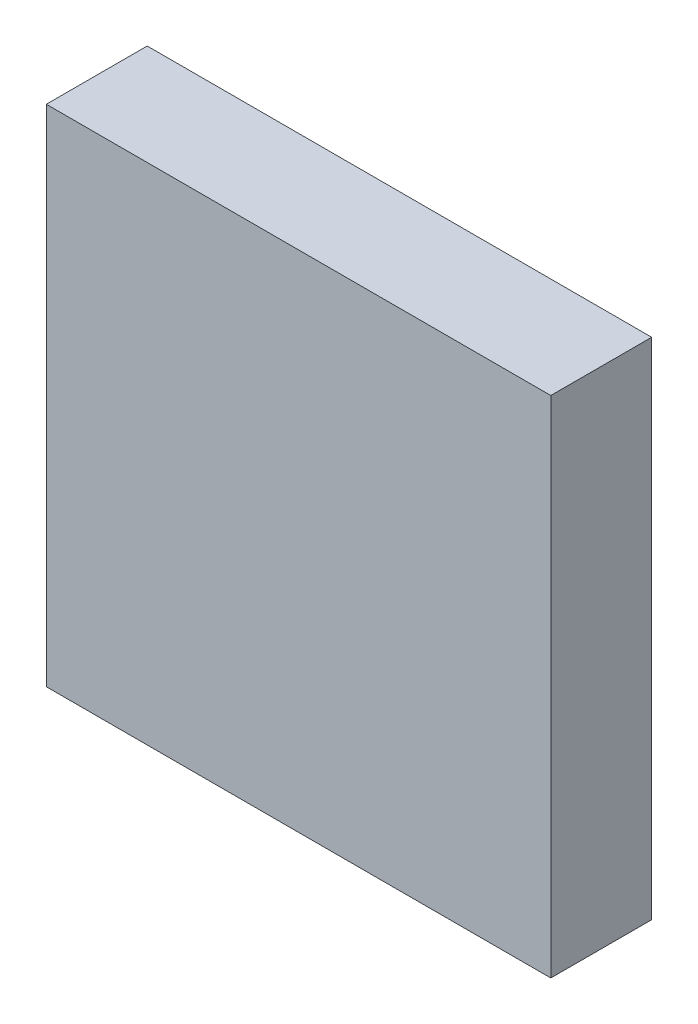
ISO-10303-21;
HEADER;
FILE_DESCRIPTION(('STEP AP214'),'2;1');
FILE_NAME('part.step','',(''),(''),'','','');
FILE_SCHEMA(('AUTOMOTIVE_DESIGN { 1 0 10303 214 1 1 1 1 }'));
ENDSEC;
DATA;
#1=APPLICATION_CONTEXT('core data for automotive mechanical design processes');
#2=APPLICATION_PROTOCOL_DEFINITION('international standard','automotive_design',2000,#1);
#3=PRODUCT_CONTEXT('',#1,'mechanical');
#4=PRODUCT('Part','Part','',(#3));
#5=PRODUCT_RELATED_PRODUCT_CATEGORY('part','',(#4));
#6=PRODUCT_DEFINITION_FORMATION('','',#4);
#7=PRODUCT_DEFINITION_CONTEXT('part definition',#1,'design');
#8=PRODUCT_DEFINITION('design','',#6,#7);
#9=PRODUCT_DEFINITION_SHAPE('','',#8);
#10=(LENGTH_UNIT() NAMED_UNIT(*) SI_UNIT(.MILLI.,.METRE.));
#11=(NAMED_UNIT(*) PLANE_ANGLE_UNIT() SI_UNIT($,.RADIAN.));
#12=(NAMED_UNIT(*) SI_UNIT($,.STERADIAN.) SOLID_ANGLE_UNIT());
#13=UNCERTAINTY_MEASURE_WITH_UNIT(LENGTH_MEASURE(1.E-05),#10,'distance_accuracy_value','');
#14=(GEOMETRIC_REPRESENTATION_CONTEXT(3) GLOBAL_UNCERTAINTY_ASSIGNED_CONTEXT((#13)) GLOBAL_UNIT_ASSIGNED_CONTEXT((#10,
#11,#12)) REPRESENTATION_CONTEXT('',''));
#15=CARTESIAN_POINT('',(0.,0.,0.));
#16=DIRECTION('',(0.,0.,1.));
#17=DIRECTION('',(1.,0.,0.));
#18=AXIS2_PLACEMENT_3D('',#15,#16,#17);
#19=CARTESIAN_POINT('',(-27.4424431619295,0.0473939608365298,-0.87999878841351));
#20=CARTESIAN_POINT('',(-22.6424431619295,0.047393751021866,-0.879998788413529));
#21=CARTESIAN_POINT('',(-27.4424431619295,0.0473938769107052,0.0800012115864866));
#22=CARTESIAN_POINT('',(-22.6424431619295,0.0473936670960415,0.0800012115864682));
#23=(BOUNDED_SURFACE() B_SPLINE_SURFACE(1,1,((#19,#20),(#21,#22)),.UNSPECIFIED.,.F.,.F.,
.F.) B_SPLINE_SURFACE_WITH_KNOTS((2,2),(2,2),(-8.E-05,0.00088),(-0.0044,0.0004),
.UNSPECIFIED.) GEOMETRIC_REPRESENTATION_ITEM() RATIONAL_B_SPLINE_SURFACE(((1.,1.),(1.,1.))) REPRESENTATION_ITEM('') SURFACE());
#24=CARTESIAN_POINT('',(-23.0424431619295,0.0473937615126097,-0.799998788413527));
#25=CARTESIAN_POINT('',(-27.0424431619295,0.0473939363581628,-0.799998788413512));
#26=(BOUNDED_CURVE() B_SPLINE_CURVE(1,(#24,#25),.UNSPECIFIED.,.F.,
.F.) B_SPLINE_CURVE_WITH_KNOTS((2,2),(0.,0.004),
.UNSPECIFIED.) CURVE() GEOMETRIC_REPRESENTATION_ITEM() RATIONAL_B_SPLINE_CURVE((1.,1.)) REPRESENTATION_ITEM(''));
#27=CARTESIAN_POINT('',(-23.0424431619295,0.0473937615126097,-0.799998788413527));
#28=VERTEX_POINT('',#27);
#29=CARTESIAN_POINT('',(-27.0424431619295,0.0473939363581644,-0.799998788413512));
#30=VERTEX_POINT('',#29);
#31=EDGE_CURVE('E182',#28,#30,#26,.T.);
#32=CARTESIAN_POINT('',(-27.0424431619295,0.0473938664199702,1.21158648521899E-06));
#33=CARTESIAN_POINT('',(-27.0424431619295,0.0473939363581573,-0.799998788413512));
#34=(BOUNDED_CURVE() B_SPLINE_CURVE(1,(#32,#33),.UNSPECIFIED.,.F.,
.F.) B_SPLINE_CURVE_WITH_KNOTS((2,2),(0.,0.0008),
.UNSPECIFIED.) CURVE() GEOMETRIC_REPRESENTATION_ITEM() RATIONAL_B_SPLINE_CURVE((1.,1.)) REPRESENTATION_ITEM(''));
#35=CARTESIAN_POINT('',(-27.0424431619295,0.0473938664199702,1.21158648521899E-06));
#36=VERTEX_POINT('',#35);
#37=EDGE_CURVE('E22',#36,#30,#34,.T.);
#38=CARTESIAN_POINT('',(-23.0424431619295,0.0473936915744155,1.21158647004016E-06));
#39=CARTESIAN_POINT('',(-27.0424431619295,0.0473938664199686,1.21158648532564E-06));
#40=(BOUNDED_CURVE() B_SPLINE_CURVE(1,(#38,#39),.UNSPECIFIED.,.F.,
.F.) B_SPLINE_CURVE_WITH_KNOTS((2,2),(0.,0.004),
.UNSPECIFIED.) CURVE() GEOMETRIC_REPRESENTATION_ITEM() RATIONAL_B_SPLINE_CURVE((1.,1.)) REPRESENTATION_ITEM(''));
#41=CARTESIAN_POINT('',(-23.0424431619295,0.0473936915744155,1.21158647004016E-06));
#42=VERTEX_POINT('',#41);
#43=EDGE_CURVE('E90',#42,#36,#40,.T.);
#44=CARTESIAN_POINT('',(-23.0424431619295,0.0473936915744155,1.21158647004016E-06));
#45=CARTESIAN_POINT('',(-23.0424431619295,0.0473937615126026,-0.799998788413527));
#46=(BOUNDED_CURVE() B_SPLINE_CURVE(1,(#44,#45),.UNSPECIFIED.,.F.,
.F.) B_SPLINE_CURVE_WITH_KNOTS((2,2),(0.,0.0008),
.UNSPECIFIED.) CURVE() GEOMETRIC_REPRESENTATION_ITEM() RATIONAL_B_SPLINE_CURVE((1.,1.)) REPRESENTATION_ITEM(''));
#47=EDGE_CURVE('E11',#42,#28,#46,.T.);
#48=ORIENTED_EDGE('',*,*,#31,.T.);
#49=ORIENTED_EDGE('',*,*,#37,.F.);
#50=ORIENTED_EDGE('',*,*,#43,.F.);
#51=ORIENTED_EDGE('',*,*,#47,.T.);
#52=EDGE_LOOP('',(#48,#49,#50,#51));
#53=FACE_BOUND('',#52,.T.);
#54=ADVANCED_FACE('F17',(#53),#23,.T.);
#55=CARTESIAN_POINT('',(-23.0424431444449,0.447393768506429,-0.879998753444433));
#56=CARTESIAN_POINT('',(-23.0424433542596,-4.35260623149358,-0.879999173073556));
#57=CARTESIAN_POINT('',(-23.0424431444449,0.447393684580604,0.0800012465555633));
#58=CARTESIAN_POINT('',(-23.0424433542596,-4.3526063154194,0.0800008269264404));
#59=(BOUNDED_SURFACE() B_SPLINE_SURFACE(1,1,((#55,#56),(#57,#58)),.UNSPECIFIED.,.F.,.F.,
.F.) B_SPLINE_SURFACE_WITH_KNOTS((2,2),(2,2),(-8.E-05,0.00088),(-0.000400000000000009,0.0044),
.UNSPECIFIED.) GEOMETRIC_REPRESENTATION_ITEM() RATIONAL_B_SPLINE_SURFACE(((1.,1.),(1.,1.))) REPRESENTATION_ITEM('') SURFACE());
#60=CARTESIAN_POINT('',(-23.042443336775,-3.95260630842558,8.6189553410998E-07));
#61=CARTESIAN_POINT('',(-23.042443336775,-3.95260623848739,-0.799999138104463));
#62=(BOUNDED_CURVE() B_SPLINE_CURVE(1,(#60,#61),.UNSPECIFIED.,.F.,
.F.) B_SPLINE_CURVE_WITH_KNOTS((2,2),(0.,0.0008),
.UNSPECIFIED.) CURVE() GEOMETRIC_REPRESENTATION_ITEM() RATIONAL_B_SPLINE_CURVE((1.,1.)) REPRESENTATION_ITEM(''));
#63=CARTESIAN_POINT('',(-23.042443336775,-3.95260630842558,8.6189553410998E-07));
#64=VERTEX_POINT('',#63);
#65=CARTESIAN_POINT('',(-23.042443336775,-3.95260623848738,-0.799999138104463));
#66=VERTEX_POINT('',#65);
#67=EDGE_CURVE('E139',#64,#66,#62,.T.);
#68=CARTESIAN_POINT('',(-23.0424431619295,0.0473937615126097,-0.799998788413527));
#69=CARTESIAN_POINT('',(-23.0424433367751,-3.95260623848738,-0.799999138104463));
#70=(BOUNDED_CURVE() B_SPLINE_CURVE(1,(#68,#69),.UNSPECIFIED.,.F.,
.F.) B_SPLINE_CURVE_WITH_KNOTS((2,2),(0.,0.004),
.UNSPECIFIED.) CURVE() GEOMETRIC_REPRESENTATION_ITEM() RATIONAL_B_SPLINE_CURVE((1.,1.)) REPRESENTATION_ITEM(''));
#71=EDGE_CURVE('E31',#28,#66,#70,.T.);
#72=CARTESIAN_POINT('',(-23.0424431619295,0.0473936915744155,1.21158647004016E-06));
#73=CARTESIAN_POINT('',(-23.0424433367751,-3.95260630842558,8.61895534276523E-07));
#74=(BOUNDED_CURVE() B_SPLINE_CURVE(1,(#72,#73),.UNSPECIFIED.,.F.,
.F.) B_SPLINE_CURVE_WITH_KNOTS((2,2),(0.,0.004),
.UNSPECIFIED.) CURVE() GEOMETRIC_REPRESENTATION_ITEM() RATIONAL_B_SPLINE_CURVE((1.,1.)) REPRESENTATION_ITEM(''));
#75=EDGE_CURVE('E67',#42,#64,#74,.T.);
#76=ORIENTED_EDGE('',*,*,#67,.T.);
#77=ORIENTED_EDGE('',*,*,#71,.F.);
#78=ORIENTED_EDGE('',*,*,#47,.F.);
#79=ORIENTED_EDGE('',*,*,#75,.T.);
#80=EDGE_LOOP('',(#76,#77,#78,#79));
#81=FACE_BOUND('',#80,.T.);
#82=ADVANCED_FACE('F89',(#81),#59,.T.);
#83=CARTESIAN_POINT('',(-22.6424431444449,0.447393744028056,-0.799998753444435));
#84=CARTESIAN_POINT('',(-27.442443144445,0.44739395384272,-0.799998753444417));
#85=CARTESIAN_POINT('',(-22.6424433542595,-4.35260625597195,-0.799999173073558));
#86=CARTESIAN_POINT('',(-27.4424433542596,-4.35260604615728,-0.799999173073539));
#87=(BOUNDED_SURFACE() B_SPLINE_SURFACE(1,1,((#83,#84),(#85,#86)),.UNSPECIFIED.,.F.,.F.,
.F.) B_SPLINE_SURFACE_WITH_KNOTS((2,2),(2,2),(-0.0004,0.0044),(-0.000400000000000061,0.0044),
.UNSPECIFIED.) GEOMETRIC_REPRESENTATION_ITEM() RATIONAL_B_SPLINE_SURFACE(((1.,1.),(1.,1.))) REPRESENTATION_ITEM('') SURFACE());
#88=CARTESIAN_POINT('',(-26.3757765353312,-0.86927275944977,-0.799998868551021));
#89=CARTESIAN_POINT('',(-26.6257765353312,-0.869272748521969,-0.79999886855102));
#90=CARTESIAN_POINT('',(-26.6257765244034,-0.619272748521948,-0.799998846695336));
#91=CARTESIAN_POINT('',(-26.6257765134756,-0.369272748521927,-0.799998824839654));
#92=CARTESIAN_POINT('',(-26.3757765134756,-0.369272759449772,-0.799998824839653));
#93=(BOUNDED_CURVE() B_SPLINE_CURVE(2,(#88,#89,#90,#91,#92),.UNSPECIFIED.,.F.,
.F.) B_SPLINE_CURVE_WITH_KNOTS((3,2,3),(-1.84741112770521E-13,1.5707963267948,3.14159265358979),
.UNSPECIFIED.) CURVE() GEOMETRIC_REPRESENTATION_ITEM() RATIONAL_B_SPLINE_CURVE((1.,
0.70710678118652,1.,0.707106781186546,1.)) REPRESENTATION_ITEM(''));
#94=CARTESIAN_POINT('',(-26.3757765353312,-0.869272759449771,-0.799998868551021));
#95=VERTEX_POINT('',#94);
#96=CARTESIAN_POINT('',(-26.3757765134756,-0.36927275944977,-0.799998824839653));
#97=VERTEX_POINT('',#96);
#98=EDGE_CURVE('E84',#95,#97,#93,.T.);
#99=CARTESIAN_POINT('',(-26.3757765134756,-0.369272759449772,-0.799998824839653));
#100=CARTESIAN_POINT('',(-26.1257765134756,-0.369272770377617,-0.799998824839654));
#101=CARTESIAN_POINT('',(-26.1257765244034,-0.619272770377594,-0.799998846695338));
#102=CARTESIAN_POINT('',(-26.1257765353312,-0.869272770377571,-0.799998868551022));
#103=CARTESIAN_POINT('',(-26.3757765353312,-0.86927275944977,-0.799998868551021));
#104=(BOUNDED_CURVE() B_SPLINE_CURVE(2,(#99,#100,#101,#102,#103),.UNSPECIFIED.,.F.,
.F.) B_SPLINE_CURVE_WITH_KNOTS((3,2,3),(3.14159265358979,4.71238898038459,6.2831853071794),
.UNSPECIFIED.) CURVE() GEOMETRIC_REPRESENTATION_ITEM() RATIONAL_B_SPLINE_CURVE((1.,
0.707106781186607,1.,0.707106781186581,1.)) REPRESENTATION_ITEM(''));
#105=EDGE_CURVE('E125',#97,#95,#104,.T.);
#106=CARTESIAN_POINT('',(-23.042443336775,-3.95260623848738,-0.799999138104463));
#107=CARTESIAN_POINT('',(-27.042443336775,-3.95260606364183,-0.799999138104448));
#108=(BOUNDED_CURVE() B_SPLINE_CURVE(1,(#106,#107),.UNSPECIFIED.,.F.,
.F.) B_SPLINE_CURVE_WITH_KNOTS((2,2),(0.,0.004),
.UNSPECIFIED.) CURVE() GEOMETRIC_REPRESENTATION_ITEM() RATIONAL_B_SPLINE_CURVE((1.,1.)) REPRESENTATION_ITEM(''));
#109=CARTESIAN_POINT('',(-27.042443336775,-3.95260606364184,-0.799999138104448));
#110=VERTEX_POINT('',#109);
#111=EDGE_CURVE('E104',#66,#110,#108,.T.);
#112=CARTESIAN_POINT('',(-27.0424431619295,0.0473939363581644,-0.799998788413512));
#113=CARTESIAN_POINT('',(-27.0424433367751,-3.95260606364184,-0.799999138104448));
#114=(BOUNDED_CURVE() B_SPLINE_CURVE(1,(#112,#113),.UNSPECIFIED.,.F.,
.F.) B_SPLINE_CURVE_WITH_KNOTS((2,2),(0.,0.004),
.UNSPECIFIED.) CURVE() GEOMETRIC_REPRESENTATION_ITEM() RATIONAL_B_SPLINE_CURVE((1.,1.)) REPRESENTATION_ITEM(''));
#115=EDGE_CURVE('E148',#30,#110,#114,.T.);
#116=ORIENTED_EDGE('',*,*,#98,.F.);
#117=ORIENTED_EDGE('',*,*,#105,.F.);
#118=EDGE_LOOP('',(#116,#117));
#119=FACE_BOUND('',#118,.T.);
#120=ORIENTED_EDGE('',*,*,#31,.F.);
#121=ORIENTED_EDGE('',*,*,#71,.T.);
#122=ORIENTED_EDGE('',*,*,#111,.T.);
#123=ORIENTED_EDGE('',*,*,#115,.F.);
#124=EDGE_LOOP('',(#120,#121,#122,#123));
#125=FACE_BOUND('',#124,.T.);
#126=ADVANCED_FACE('F206',(#119,#125),#87,.T.);
#127=CARTESIAN_POINT('',(-27.0424431444449,0.447393859426159,0.0800012465555788));
#128=CARTESIAN_POINT('',(-27.0424433542596,-4.35260614057385,0.0800008269264559));
#129=CARTESIAN_POINT('',(-27.0424431444449,0.447393943351984,-0.879998753444419));
#130=CARTESIAN_POINT('',(-27.0424433542596,-4.35260605664802,-0.879999173073541));
#131=(BOUNDED_SURFACE() B_SPLINE_SURFACE(1,1,((#127,#128),(#129,#130)),.UNSPECIFIED.,.F.,.F.,
.F.) B_SPLINE_SURFACE_WITH_KNOTS((2,2),(2,2),(-8.E-05,0.00088),(-0.00040000000000001,0.0044),
.UNSPECIFIED.) GEOMETRIC_REPRESENTATION_ITEM() RATIONAL_B_SPLINE_SURFACE(((1.,1.),(1.,1.))) REPRESENTATION_ITEM('') SURFACE());
#132=CARTESIAN_POINT('',(-27.0424431619295,0.0473938664199702,1.21158648521899E-06));
#133=CARTESIAN_POINT('',(-27.0424433367751,-3.95260613358002,8.61895549455354E-07));
#134=(BOUNDED_CURVE() B_SPLINE_CURVE(1,(#132,#133),.UNSPECIFIED.,.F.,
.F.) B_SPLINE_CURVE_WITH_KNOTS((2,2),(0.,0.004),
.UNSPECIFIED.) CURVE() GEOMETRIC_REPRESENTATION_ITEM() RATIONAL_B_SPLINE_CURVE((1.,1.)) REPRESENTATION_ITEM(''));
#135=CARTESIAN_POINT('',(-27.042443336775,-3.95260613358002,8.61895549722491E-07));
#136=VERTEX_POINT('',#135);
#137=EDGE_CURVE('E53',#36,#136,#134,.T.);
#138=CARTESIAN_POINT('',(-27.042443336775,-3.95260613358002,8.61895549722491E-07));
#139=CARTESIAN_POINT('',(-27.042443336775,-3.95260606364183,-0.799999138104448));
#140=(BOUNDED_CURVE() B_SPLINE_CURVE(1,(#138,#139),.UNSPECIFIED.,.F.,
.F.) B_SPLINE_CURVE_WITH_KNOTS((2,2),(0.,0.0008),
.UNSPECIFIED.) CURVE() GEOMETRIC_REPRESENTATION_ITEM() RATIONAL_B_SPLINE_CURVE((1.,1.)) REPRESENTATION_ITEM(''));
#141=EDGE_CURVE('E164',#136,#110,#140,.T.);
#142=ORIENTED_EDGE('',*,*,#137,.F.);
#143=ORIENTED_EDGE('',*,*,#37,.T.);
#144=ORIENTED_EDGE('',*,*,#115,.T.);
#145=ORIENTED_EDGE('',*,*,#141,.F.);
#146=EDGE_LOOP('',(#142,#143,#144,#145));
#147=FACE_BOUND('',#146,.T.);
#148=ADVANCED_FACE('F204',(#147),#131,.T.);
#149=CARTESIAN_POINT('',(-22.6424433542595,-4.35260632591014,8.26926439171611E-07));
#150=CARTESIAN_POINT('',(-27.4424433542596,-4.35260611609547,8.26926457514184E-07));
#151=CARTESIAN_POINT('',(-22.6424431444449,0.447393674089862,1.24655556208798E-06));
#152=CARTESIAN_POINT('',(-27.442443144445,0.447393883904525,1.24655558043055E-06));
#153=(BOUNDED_SURFACE() B_SPLINE_SURFACE(1,1,((#149,#150),(#151,#152)),.UNSPECIFIED.,.F.,.F.,
.F.) B_SPLINE_SURFACE_WITH_KNOTS((2,2),(2,2),(-0.0004,0.0044),(-0.000400000000000061,0.0044),
.UNSPECIFIED.) GEOMETRIC_REPRESENTATION_ITEM() RATIONAL_B_SPLINE_SURFACE(((1.,1.),(1.,1.))) REPRESENTATION_ITEM('') SURFACE());
#154=CARTESIAN_POINT('',(-23.042443336775,-3.95260630842558,8.6189553410998E-07));
#155=CARTESIAN_POINT('',(-27.042443336775,-3.95260613358003,8.61895549395457E-07));
#156=(BOUNDED_CURVE() B_SPLINE_CURVE(1,(#154,#155),.UNSPECIFIED.,.F.,
.F.) B_SPLINE_CURVE_WITH_KNOTS((2,2),(0.,0.004),
.UNSPECIFIED.) CURVE() GEOMETRIC_REPRESENTATION_ITEM() RATIONAL_B_SPLINE_CURVE((1.,1.)) REPRESENTATION_ITEM(''));
#157=EDGE_CURVE('E96',#64,#136,#156,.T.);
#158=ORIENTED_EDGE('',*,*,#137,.T.);
#159=ORIENTED_EDGE('',*,*,#157,.F.);
#160=ORIENTED_EDGE('',*,*,#75,.F.);
#161=ORIENTED_EDGE('',*,*,#43,.T.);
#162=EDGE_LOOP('',(#158,#159,#160,#161));
#163=FACE_BOUND('',#162,.T.);
#164=ADVANCED_FACE('F94',(#163),#153,.T.);
#165=CARTESIAN_POINT('',(-27.442443336775,-3.95260612308929,0.080000861895551));
#166=CARTESIAN_POINT('',(-22.642443336775,-3.95260633290395,0.0800008618955327));
#167=CARTESIAN_POINT('',(-27.442443336775,-3.95260603916347,-0.879999138104446));
#168=CARTESIAN_POINT('',(-22.642443336775,-3.95260624897813,-0.879999138104465));
#169=(BOUNDED_SURFACE() B_SPLINE_SURFACE(1,1,((#165,#166),(#167,#168)),.UNSPECIFIED.,.F.,.F.,
.F.) B_SPLINE_SURFACE_WITH_KNOTS((2,2),(2,2),(-8.E-05,0.00088),(-0.0044,0.0004),
.UNSPECIFIED.) GEOMETRIC_REPRESENTATION_ITEM() RATIONAL_B_SPLINE_SURFACE(((1.,1.),(1.,1.))) REPRESENTATION_ITEM('') SURFACE());
#170=ORIENTED_EDGE('',*,*,#67,.F.);
#171=ORIENTED_EDGE('',*,*,#157,.T.);
#172=ORIENTED_EDGE('',*,*,#141,.T.);
#173=ORIENTED_EDGE('',*,*,#111,.F.);
#174=EDGE_LOOP('',(#170,#171,#172,#173));
#175=FACE_BOUND('',#174,.T.);
#176=ADVANCED_FACE('F214',(#175),#169,.T.);
#177=CARTESIAN_POINT('',(-26.3757765134756,-0.369272768192043,-0.699998824839654));
#178=CARTESIAN_POINT('',(-26.1257765134756,-0.369272779119889,-0.699998824839655));
#179=CARTESIAN_POINT('',(-26.1257765244034,-0.619272779119887,-0.699998846695339));
#180=CARTESIAN_POINT('',(-26.1257765353312,-0.869272779119886,-0.699998868551022));
#181=CARTESIAN_POINT('',(-26.3757765353312,-0.869272768192041,-0.699998868551022));
#182=CARTESIAN_POINT('',(-26.6257765353312,-0.869272757264194,-0.699998868551021));
#183=CARTESIAN_POINT('',(-26.6257765244034,-0.619272757264197,-0.699998846695337));
#184=CARTESIAN_POINT('',(-26.6257765134756,-0.369272757264198,-0.699998824839654));
#185=CARTESIAN_POINT('',(-26.3757765134756,-0.369272768192043,-0.699998824839654));
#186=CARTESIAN_POINT('',(-26.3757765134756,-0.36927275944977,-0.799998824839653));
#187=CARTESIAN_POINT('',(-26.1257765134756,-0.369272770377615,-0.799998824839654));
#188=CARTESIAN_POINT('',(-26.1257765244034,-0.619272770377614,-0.799998846695338));
#189=CARTESIAN_POINT('',(-26.1257765353312,-0.869272770377613,-0.799998868551023));
#190=CARTESIAN_POINT('',(-26.3757765353312,-0.869272759449767,-0.799998868551021));
#191=CARTESIAN_POINT('',(-26.6257765353312,-0.869272748521922,-0.79999886855102));
#192=CARTESIAN_POINT('',(-26.6257765244034,-0.619272748521923,-0.799998846695336));
#193=CARTESIAN_POINT('',(-26.6257765134756,-0.369272748521925,-0.799998824839653));
#194=CARTESIAN_POINT('',(-26.3757765134756,-0.36927275944977,-0.799998824839653));
#195=(BOUNDED_SURFACE() B_SPLINE_SURFACE(1,2,((#177,#178,#179,#180,#181,#182,#183,#184,#185),
(#186,#187,#188,#189,#190,#191,#192,#193,#194)),.UNSPECIFIED.,.F.,.T.,
.F.) B_SPLINE_SURFACE_WITH_KNOTS((2,2),(3,2,2,2,3),(0.,0.4),(-3.14159265358979,-1.5707963267949,
0.,1.5707963267949,3.14159265358979),
.UNSPECIFIED.) GEOMETRIC_REPRESENTATION_ITEM() RATIONAL_B_SPLINE_SURFACE(((1.,0.707106781186548,
1.,0.707106781186548,1.,0.707106781186548,1.,0.707106781186548,1.),(1.,0.707106781186548,1.,
0.707106781186548,1.,0.707106781186548,1.,0.707106781186548,1.))) REPRESENTATION_ITEM('') SURFACE());
#196=CARTESIAN_POINT('',(-26.3757765353312,-0.869272768192041,-0.699998868551022));
#197=CARTESIAN_POINT('',(-26.6257765353312,-0.86927275726424,-0.69999886855102));
#198=CARTESIAN_POINT('',(-26.6257765244034,-0.619272757264219,-0.699998846695337));
#199=CARTESIAN_POINT('',(-26.6257765134756,-0.369272757264198,-0.699998824839655));
#200=CARTESIAN_POINT('',(-26.3757765134756,-0.369272768192043,-0.699998824839654));
#201=(BOUNDED_CURVE() B_SPLINE_CURVE(2,(#196,#197,#198,#199,#200),.UNSPECIFIED.,.F.,
.F.) B_SPLINE_CURVE_WITH_KNOTS((3,2,3),(-1.84741112760182E-13,1.5707963267948,3.14159265358979),
.UNSPECIFIED.) CURVE() GEOMETRIC_REPRESENTATION_ITEM() RATIONAL_B_SPLINE_CURVE((1.,
0.70710678118652,1.,0.707106781186546,1.)) REPRESENTATION_ITEM(''));
#202=CARTESIAN_POINT('',(-26.3757765353312,-0.869272768192042,-0.699998868551022));
#203=VERTEX_POINT('',#202);
#204=CARTESIAN_POINT('',(-26.3757765134756,-0.369272768192043,-0.699998824839654));
#205=VERTEX_POINT('',#204);
#206=EDGE_CURVE('E124',#203,#205,#201,.T.);
#207=CARTESIAN_POINT('',(-26.3757765134756,-0.369272768192043,-0.699998824839654));
#208=CARTESIAN_POINT('',(-26.1257765134756,-0.369272779119889,-0.699998824839655));
#209=CARTESIAN_POINT('',(-26.1257765244034,-0.619272779119865,-0.699998846695339));
#210=CARTESIAN_POINT('',(-26.1257765353312,-0.869272779119841,-0.699998868551024));
#211=CARTESIAN_POINT('',(-26.3757765353312,-0.869272768192041,-0.699998868551022));
#212=(BOUNDED_CURVE() B_SPLINE_CURVE(2,(#207,#208,#209,#210,#211),.UNSPECIFIED.,.F.,
.F.) B_SPLINE_CURVE_WITH_KNOTS((3,2,3),(3.14159265358979,4.71238898038459,6.2831853071794),
.UNSPECIFIED.) CURVE() GEOMETRIC_REPRESENTATION_ITEM() RATIONAL_B_SPLINE_CURVE((1.,
0.707106781186607,1.,0.707106781186581,1.)) REPRESENTATION_ITEM(''));
#213=EDGE_CURVE('E117',#205,#203,#212,.T.);
#214=CARTESIAN_POINT('',(-26.3757765134756,-0.369272768192043,-0.699998824839654));
#215=CARTESIAN_POINT('',(-26.3757765134756,-0.36927275944977,-0.799998824839653));
#216=(BOUNDED_CURVE() B_SPLINE_CURVE(1,(#214,#215),.UNSPECIFIED.,.F.,
.F.) B_SPLINE_CURVE_WITH_KNOTS((2,2),(0.,0.4),
.UNSPECIFIED.) CURVE() GEOMETRIC_REPRESENTATION_ITEM() RATIONAL_B_SPLINE_CURVE((1.,1.)) REPRESENTATION_ITEM(''));
#217=EDGE_CURVE('E81',#205,#97,#216,.T.);
#218=ORIENTED_EDGE('',*,*,#206,.F.);
#219=ORIENTED_EDGE('',*,*,#213,.F.);
#220=ORIENTED_EDGE('',*,*,#217,.T.);
#221=ORIENTED_EDGE('',*,*,#105,.T.);
#222=ORIENTED_EDGE('',*,*,#98,.T.);
#223=ORIENTED_EDGE('',*,*,#217,.F.);
#224=EDGE_LOOP('',(#218,#219,#220,#221,#222,#223));
#225=FACE_BOUND('',#224,.T.);
#226=ADVANCED_FACE('F235',(#225),#195,.T.);
#227=CARTESIAN_POINT('',(-26.0757765112899,-0.319272781305405,-0.699998820468519));
#228=CARTESIAN_POINT('',(-26.67577651129,-0.319272755078572,-0.699998820468517));
#229=CARTESIAN_POINT('',(-26.0757765375168,-0.919272781305512,-0.699998872922159));
#230=CARTESIAN_POINT('',(-26.6757765375169,-0.919272755078679,-0.699998872922157));
#231=(BOUNDED_SURFACE() B_SPLINE_SURFACE(1,1,((#227,#228),(#229,#230)),.UNSPECIFIED.,.F.,.F.,
.F.) B_SPLINE_SURFACE_WITH_KNOTS((2,2),(2,2),(-0.000300000000000055,0.000300000000000055),
(-0.000300000000000054,0.000300000000000054),
.UNSPECIFIED.) GEOMETRIC_REPRESENTATION_ITEM() RATIONAL_B_SPLINE_SURFACE(((1.,1.),(1.,1.))) REPRESENTATION_ITEM('') SURFACE());
#232=ORIENTED_EDGE('',*,*,#206,.T.);
#233=ORIENTED_EDGE('',*,*,#213,.T.);
#234=EDGE_LOOP('',(#232,#233));
#235=FACE_BOUND('',#234,.T.);
#236=ADVANCED_FACE('F244',(#235),#231,.T.);
#237=CLOSED_SHELL('',(#54,#82,#126,#148,#164,#176,#226,#236));
#238=MANIFOLD_SOLID_BREP('B1',#237);
#239=ADVANCED_BREP_SHAPE_REPRESENTATION('',(#18,#238),#14);
#240=SHAPE_DEFINITION_REPRESENTATION(#9,#239);
ENDSEC;
END-ISO-10303-21;
